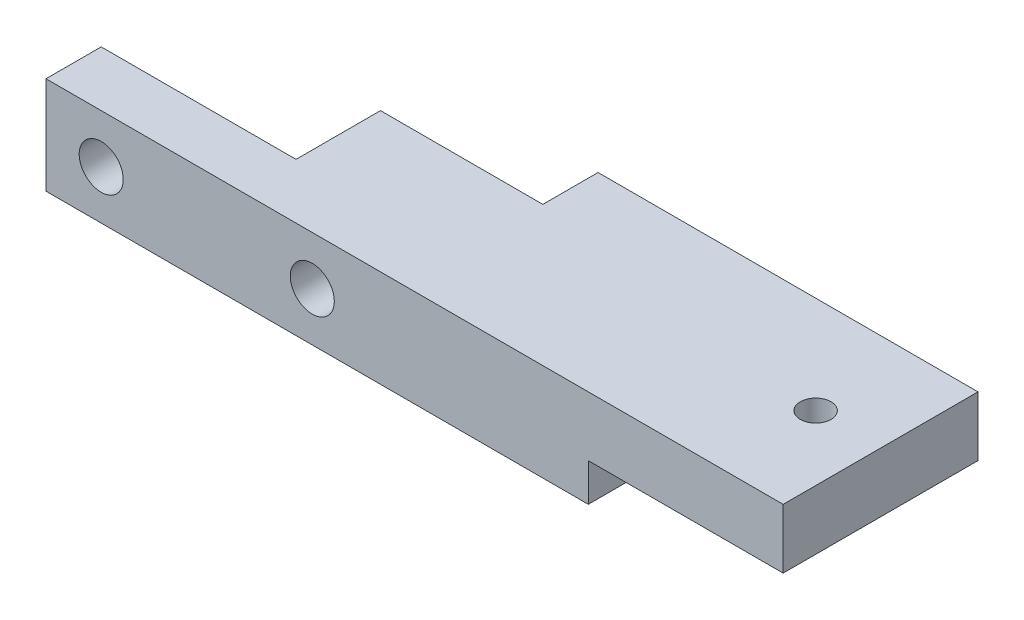
ISO-10303-21;
HEADER;
FILE_DESCRIPTION(('STEP AP214'),'2;1');
FILE_NAME('part.step','',(''),(''),'','','');
FILE_SCHEMA(('AUTOMOTIVE_DESIGN { 1 0 10303 214 1 1 1 1 }'));
ENDSEC;
DATA;
#1=APPLICATION_CONTEXT('core data for automotive mechanical design processes');
#2=APPLICATION_PROTOCOL_DEFINITION('international standard','automotive_design',2000,#1);
#3=PRODUCT_CONTEXT('',#1,'mechanical');
#4=PRODUCT('Part','Part','',(#3));
#5=PRODUCT_RELATED_PRODUCT_CATEGORY('part','',(#4));
#6=PRODUCT_DEFINITION_FORMATION('','',#4);
#7=PRODUCT_DEFINITION_CONTEXT('part definition',#1,'design');
#8=PRODUCT_DEFINITION('design','',#6,#7);
#9=PRODUCT_DEFINITION_SHAPE('','',#8);
#10=(LENGTH_UNIT() NAMED_UNIT(*) SI_UNIT(.MILLI.,.METRE.));
#11=(NAMED_UNIT(*) PLANE_ANGLE_UNIT() SI_UNIT($,.RADIAN.));
#12=(NAMED_UNIT(*) SI_UNIT($,.STERADIAN.) SOLID_ANGLE_UNIT());
#13=UNCERTAINTY_MEASURE_WITH_UNIT(LENGTH_MEASURE(1.E-05),#10,'distance_accuracy_value','');
#14=(GEOMETRIC_REPRESENTATION_CONTEXT(3) GLOBAL_UNCERTAINTY_ASSIGNED_CONTEXT((#13)) GLOBAL_UNIT_ASSIGNED_CONTEXT((#10,
#11,#12)) REPRESENTATION_CONTEXT('',''));
#15=CARTESIAN_POINT('',(0.,0.,0.));
#16=DIRECTION('',(0.,0.,1.));
#17=DIRECTION('',(1.,0.,0.));
#18=AXIS2_PLACEMENT_3D('',#15,#16,#17);
#19=CARTESIAN_POINT('',(0.,4.7625,0.));
#20=DIRECTION('',(0.,-1.,0.));
#21=DIRECTION('',(0.,0.,-1.));
#22=AXIS2_PLACEMENT_3D('',#19,#20,#21);
#23=PLANE('',#22);
#24=DIRECTION('',(0.,0.,1.));
#25=VECTOR('',#24,1.);
#26=CARTESIAN_POINT('',(20.0024999999999,4.7625,-9.52500000000001));
#27=LINE('',#26,#25);
#28=CARTESIAN_POINT('',(20.0024999999999,4.7625,-9.52500000000001));
#29=VERTEX_POINT('',#28);
#30=CARTESIAN_POINT('',(20.0025,4.7625,-4.1275));
#31=VERTEX_POINT('',#30);
#32=EDGE_CURVE('E158',#29,#31,#27,.T.);
#33=ORIENTED_EDGE('',*,*,#32,.T.);
#34=DIRECTION('',(-1.,0.,0.));
#35=VECTOR('',#34,1.);
#36=CARTESIAN_POINT('',(20.0025,4.7625,-4.1275));
#37=LINE('',#36,#35);
#38=CARTESIAN_POINT('',(4.1275,4.7625,-4.1275));
#39=VERTEX_POINT('',#38);
#40=EDGE_CURVE('E95',#31,#39,#37,.T.);
#41=ORIENTED_EDGE('',*,*,#40,.T.);
#42=DIRECTION('',(0.,0.,1.));
#43=VECTOR('',#42,1.);
#44=CARTESIAN_POINT('',(4.1275,4.7625,-4.1275));
#45=LINE('',#44,#43);
#46=CARTESIAN_POINT('',(4.1275,4.7625,4.1275));
#47=VERTEX_POINT('',#46);
#48=EDGE_CURVE('E174',#39,#47,#45,.T.);
#49=ORIENTED_EDGE('',*,*,#48,.T.);
#50=DIRECTION('',(-1.,0.,0.));
#51=VECTOR('',#50,1.);
#52=CARTESIAN_POINT('',(-14.9225,4.7625,4.1275));
#53=LINE('',#52,#51);
#54=CARTESIAN_POINT('',(-14.9225,4.7625,4.1275));
#55=VERTEX_POINT('',#54);
#56=EDGE_CURVE('E188',#47,#55,#53,.T.);
#57=ORIENTED_EDGE('',*,*,#56,.T.);
#58=DIRECTION('',(0.,0.,1.));
#59=VECTOR('',#58,1.);
#60=CARTESIAN_POINT('',(-14.9225,4.7625,4.1275));
#61=LINE('',#60,#59);
#62=CARTESIAN_POINT('',(-14.9225,4.7625,9.525));
#63=VERTEX_POINT('',#62);
#64=EDGE_CURVE('E118',#55,#63,#61,.T.);
#65=ORIENTED_EDGE('',*,*,#64,.T.);
#66=DIRECTION('',(1.,0.,0.));
#67=VECTOR('',#66,1.);
#68=CARTESIAN_POINT('',(-14.9225,4.7625,9.525));
#69=LINE('',#68,#67);
#70=CARTESIAN_POINT('',(57.15,4.7625,9.525));
#71=VERTEX_POINT('',#70);
#72=EDGE_CURVE('E111',#63,#71,#69,.T.);
#73=ORIENTED_EDGE('',*,*,#72,.T.);
#74=DIRECTION('',(0.,0.,-1.));
#75=VECTOR('',#74,1.);
#76=CARTESIAN_POINT('',(57.15,4.7625,-9.525));
#77=LINE('',#76,#75);
#78=CARTESIAN_POINT('',(57.15,4.7625,-9.525));
#79=VERTEX_POINT('',#78);
#80=EDGE_CURVE('E115',#71,#79,#77,.T.);
#81=ORIENTED_EDGE('',*,*,#80,.T.);
#82=DIRECTION('',(-1.,0.,0.));
#83=VECTOR('',#82,1.);
#84=CARTESIAN_POINT('',(20.0024999999999,4.7625,-9.52500000000001));
#85=LINE('',#84,#83);
#86=EDGE_CURVE('E60',#79,#29,#85,.T.);
#87=ORIENTED_EDGE('',*,*,#86,.T.);
#88=EDGE_LOOP('',(#33,#41,#49,#57,#65,#73,#81,#87));
#89=FACE_BOUND('',#88,.T.);
#90=CARTESIAN_POINT('',(50.8,4.7625,0.));
#91=DIRECTION('',(0.,1.,0.));
#92=DIRECTION('',(0.,0.,1.));
#93=AXIS2_PLACEMENT_3D('',#90,#91,#92);
#94=CIRCLE('',#93,1.5);
#95=CARTESIAN_POINT('',(50.8,4.7625,-1.5));
#96=VERTEX_POINT('',#95);
#97=EDGE_CURVE('E147',#96,#96,#94,.T.);
#98=ORIENTED_EDGE('',*,*,#97,.F.);
#99=EDGE_LOOP('',(#98));
#100=FACE_BOUND('',#99,.T.);
#101=ADVANCED_FACE('F35',(#89,#100),#23,.F.);
#102=CARTESIAN_POINT('',(0.,-4.7625,0.));
#103=DIRECTION('',(0.,-1.,0.));
#104=DIRECTION('',(0.,0.,-1.));
#105=AXIS2_PLACEMENT_3D('',#102,#103,#104);
#106=PLANE('',#105);
#107=DIRECTION('',(0.,0.,-1.));
#108=VECTOR('',#107,1.);
#109=CARTESIAN_POINT('',(38.1,-4.7625,9.525));
#110=LINE('',#109,#108);
#111=CARTESIAN_POINT('',(38.1,-4.7625,9.525));
#112=VERTEX_POINT('',#111);
#113=CARTESIAN_POINT('',(38.1,-4.7625,-9.525));
#114=VERTEX_POINT('',#113);
#115=EDGE_CURVE('E214',#112,#114,#110,.T.);
#116=ORIENTED_EDGE('',*,*,#115,.F.);
#117=DIRECTION('',(1.,0.,0.));
#118=VECTOR('',#117,1.);
#119=CARTESIAN_POINT('',(-14.9225,-4.7625,9.525));
#120=LINE('',#119,#118);
#121=CARTESIAN_POINT('',(-14.9225,-4.7625,9.525));
#122=VERTEX_POINT('',#121);
#123=EDGE_CURVE('E155',#122,#112,#120,.T.);
#124=ORIENTED_EDGE('',*,*,#123,.F.);
#125=DIRECTION('',(0.,0.,1.));
#126=VECTOR('',#125,1.);
#127=CARTESIAN_POINT('',(-14.9225,-4.7625,4.1275));
#128=LINE('',#127,#126);
#129=CARTESIAN_POINT('',(-14.9225,-4.7625,4.1275));
#130=VERTEX_POINT('',#129);
#131=EDGE_CURVE('E153',#130,#122,#128,.T.);
#132=ORIENTED_EDGE('',*,*,#131,.F.);
#133=DIRECTION('',(-1.,0.,0.));
#134=VECTOR('',#133,1.);
#135=CARTESIAN_POINT('',(-14.9225,-4.7625,4.1275));
#136=LINE('',#135,#134);
#137=CARTESIAN_POINT('',(4.1275,-4.7625,4.1275));
#138=VERTEX_POINT('',#137);
#139=EDGE_CURVE('E151',#138,#130,#136,.T.);
#140=ORIENTED_EDGE('',*,*,#139,.F.);
#141=DIRECTION('',(0.,0.,1.));
#142=VECTOR('',#141,1.);
#143=CARTESIAN_POINT('',(4.1275,-4.7625,-4.1275));
#144=LINE('',#143,#142);
#145=CARTESIAN_POINT('',(4.1275,-4.7625,-4.1275));
#146=VERTEX_POINT('',#145);
#147=EDGE_CURVE('E149',#146,#138,#144,.T.);
#148=ORIENTED_EDGE('',*,*,#147,.F.);
#149=DIRECTION('',(-1.,0.,0.));
#150=VECTOR('',#149,1.);
#151=CARTESIAN_POINT('',(20.0025,-4.7625,-4.1275));
#152=LINE('',#151,#150);
#153=CARTESIAN_POINT('',(20.0025,-4.7625,-4.1275));
#154=VERTEX_POINT('',#153);
#155=EDGE_CURVE('E146',#154,#146,#152,.T.);
#156=ORIENTED_EDGE('',*,*,#155,.F.);
#157=DIRECTION('',(0.,0.,1.));
#158=VECTOR('',#157,1.);
#159=CARTESIAN_POINT('',(20.0024999999999,-4.7625,-9.52500000000001));
#160=LINE('',#159,#158);
#161=CARTESIAN_POINT('',(20.0024999999999,-4.7625,-9.52500000000001));
#162=VERTEX_POINT('',#161);
#163=EDGE_CURVE('E143',#162,#154,#160,.T.);
#164=ORIENTED_EDGE('',*,*,#163,.F.);
#165=DIRECTION('',(-1.,0.,0.));
#166=VECTOR('',#165,1.);
#167=CARTESIAN_POINT('',(20.0024999999999,-4.7625,-9.52500000000001));
#168=LINE('',#167,#166);
#169=EDGE_CURVE('E87',#114,#162,#168,.T.);
#170=ORIENTED_EDGE('',*,*,#169,.F.);
#171=EDGE_LOOP('',(#116,#124,#132,#140,#148,#156,#164,#170));
#172=FACE_BOUND('',#171,.T.);
#173=ADVANCED_FACE('F178',(#172),#106,.T.);
#174=CARTESIAN_POINT('',(20.0024999999999,4.7625,-9.52500000000001));
#175=DIRECTION('',(1.,0.,0.));
#176=DIRECTION('',(0.,0.,-1.));
#177=AXIS2_PLACEMENT_3D('',#174,#175,#176);
#178=PLANE('',#177);
#179=ORIENTED_EDGE('',*,*,#163,.T.);
#180=DIRECTION('',(0.,-1.,0.));
#181=VECTOR('',#180,1.);
#182=CARTESIAN_POINT('',(20.0025,4.7625,-4.1275));
#183=LINE('',#182,#181);
#184=EDGE_CURVE('E11',#31,#154,#183,.T.);
#185=ORIENTED_EDGE('',*,*,#184,.F.);
#186=ORIENTED_EDGE('',*,*,#32,.F.);
#187=DIRECTION('',(0.,-1.,0.));
#188=VECTOR('',#187,1.);
#189=CARTESIAN_POINT('',(20.0024999999999,4.7625,-9.52500000000001));
#190=LINE('',#189,#188);
#191=EDGE_CURVE('E139',#29,#162,#190,.T.);
#192=ORIENTED_EDGE('',*,*,#191,.T.);
#193=EDGE_LOOP('',(#179,#185,#186,#192));
#194=FACE_BOUND('',#193,.T.);
#195=ADVANCED_FACE('F37',(#194),#178,.F.);
#196=CARTESIAN_POINT('',(20.0025,4.7625,-4.1275));
#197=DIRECTION('',(0.,0.,1.));
#198=DIRECTION('',(1.,0.,0.));
#199=AXIS2_PLACEMENT_3D('',#196,#197,#198);
#200=PLANE('',#199);
#201=CARTESIAN_POINT('',(11.1125,0.,-4.1275));
#202=DIRECTION('',(0.,0.,1.));
#203=DIRECTION('',(1.,0.,0.));
#204=AXIS2_PLACEMENT_3D('',#201,#202,#203);
#205=CIRCLE('',#204,2.15265);
#206=CARTESIAN_POINT('',(13.26515,0.,-4.1275));
#207=VERTEX_POINT('',#206);
#208=EDGE_CURVE('E202',#207,#207,#205,.T.);
#209=ORIENTED_EDGE('',*,*,#208,.T.);
#210=EDGE_LOOP('',(#209));
#211=FACE_BOUND('',#210,.T.);
#212=ORIENTED_EDGE('',*,*,#155,.T.);
#213=DIRECTION('',(0.,-1.,0.));
#214=VECTOR('',#213,1.);
#215=CARTESIAN_POINT('',(4.1275,4.7625,-4.1275));
#216=LINE('',#215,#214);
#217=EDGE_CURVE('E44',#39,#146,#216,.T.);
#218=ORIENTED_EDGE('',*,*,#217,.F.);
#219=ORIENTED_EDGE('',*,*,#40,.F.);
#220=ORIENTED_EDGE('',*,*,#184,.T.);
#221=EDGE_LOOP('',(#212,#218,#219,#220));
#222=FACE_BOUND('',#221,.T.);
#223=ADVANCED_FACE('F231',(#211,#222),#200,.F.);
#224=CARTESIAN_POINT('',(4.1275,4.7625,-4.1275));
#225=DIRECTION('',(1.,0.,0.));
#226=DIRECTION('',(0.,0.,-1.));
#227=AXIS2_PLACEMENT_3D('',#224,#225,#226);
#228=PLANE('',#227);
#229=ORIENTED_EDGE('',*,*,#147,.T.);
#230=DIRECTION('',(0.,-1.,0.));
#231=VECTOR('',#230,1.);
#232=CARTESIAN_POINT('',(4.1275,4.7625,4.1275));
#233=LINE('',#232,#231);
#234=EDGE_CURVE('E165',#47,#138,#233,.T.);
#235=ORIENTED_EDGE('',*,*,#234,.F.);
#236=ORIENTED_EDGE('',*,*,#48,.F.);
#237=ORIENTED_EDGE('',*,*,#217,.T.);
#238=EDGE_LOOP('',(#229,#235,#236,#237));
#239=FACE_BOUND('',#238,.T.);
#240=ADVANCED_FACE('F172',(#239),#228,.F.);
#241=CARTESIAN_POINT('',(-14.9225,4.7625,4.1275));
#242=DIRECTION('',(0.,0.,1.));
#243=DIRECTION('',(1.,0.,0.));
#244=AXIS2_PLACEMENT_3D('',#241,#242,#243);
#245=PLANE('',#244);
#246=CARTESIAN_POINT('',(-9.525,0.,4.1275));
#247=DIRECTION('',(0.,0.,1.));
#248=DIRECTION('',(1.,0.,0.));
#249=AXIS2_PLACEMENT_3D('',#246,#247,#248);
#250=CIRCLE('',#249,2.15265);
#251=CARTESIAN_POINT('',(-7.37235,0.,4.1275));
#252=VERTEX_POINT('',#251);
#253=EDGE_CURVE('E196',#252,#252,#250,.T.);
#254=ORIENTED_EDGE('',*,*,#253,.T.);
#255=EDGE_LOOP('',(#254));
#256=FACE_BOUND('',#255,.T.);
#257=ORIENTED_EDGE('',*,*,#139,.T.);
#258=DIRECTION('',(0.,-1.,0.));
#259=VECTOR('',#258,1.);
#260=CARTESIAN_POINT('',(-14.9225,4.7625,4.1275));
#261=LINE('',#260,#259);
#262=EDGE_CURVE('E162',#55,#130,#261,.T.);
#263=ORIENTED_EDGE('',*,*,#262,.F.);
#264=ORIENTED_EDGE('',*,*,#56,.F.);
#265=ORIENTED_EDGE('',*,*,#234,.T.);
#266=EDGE_LOOP('',(#257,#263,#264,#265));
#267=FACE_BOUND('',#266,.T.);
#268=ADVANCED_FACE('F184',(#256,#267),#245,.F.);
#269=CARTESIAN_POINT('',(-14.9225,4.7625,4.1275));
#270=DIRECTION('',(1.,0.,0.));
#271=DIRECTION('',(0.,0.,-1.));
#272=AXIS2_PLACEMENT_3D('',#269,#270,#271);
#273=PLANE('',#272);
#274=ORIENTED_EDGE('',*,*,#131,.T.);
#275=DIRECTION('',(0.,-1.,0.));
#276=VECTOR('',#275,1.);
#277=CARTESIAN_POINT('',(-14.9225,4.7625,9.525));
#278=LINE('',#277,#276);
#279=EDGE_CURVE('E133',#63,#122,#278,.T.);
#280=ORIENTED_EDGE('',*,*,#279,.F.);
#281=ORIENTED_EDGE('',*,*,#64,.F.);
#282=ORIENTED_EDGE('',*,*,#262,.T.);
#283=EDGE_LOOP('',(#274,#280,#281,#282));
#284=FACE_BOUND('',#283,.T.);
#285=ADVANCED_FACE('F187',(#284),#273,.F.);
#286=CARTESIAN_POINT('',(-14.9225,4.7625,9.525));
#287=DIRECTION('',(0.,0.,-1.));
#288=DIRECTION('',(-1.,0.,0.));
#289=AXIS2_PLACEMENT_3D('',#286,#287,#288);
#290=PLANE('',#289);
#291=CARTESIAN_POINT('',(11.1125,0.,9.525));
#292=DIRECTION('',(0.,0.,1.));
#293=DIRECTION('',(1.,0.,0.));
#294=AXIS2_PLACEMENT_3D('',#291,#292,#293);
#295=CIRCLE('',#294,2.15265);
#296=CARTESIAN_POINT('',(13.26515,0.,9.525));
#297=VERTEX_POINT('',#296);
#298=EDGE_CURVE('E205',#297,#297,#295,.T.);
#299=ORIENTED_EDGE('',*,*,#298,.F.);
#300=EDGE_LOOP('',(#299));
#301=FACE_BOUND('',#300,.T.);
#302=CARTESIAN_POINT('',(-9.525,0.,9.525));
#303=DIRECTION('',(0.,0.,1.));
#304=DIRECTION('',(1.,0.,0.));
#305=AXIS2_PLACEMENT_3D('',#302,#303,#304);
#306=CIRCLE('',#305,2.15265);
#307=CARTESIAN_POINT('',(-7.37235,0.,9.525));
#308=VERTEX_POINT('',#307);
#309=EDGE_CURVE('E199',#308,#308,#306,.T.);
#310=ORIENTED_EDGE('',*,*,#309,.F.);
#311=EDGE_LOOP('',(#310));
#312=FACE_BOUND('',#311,.T.);
#313=ORIENTED_EDGE('',*,*,#123,.T.);
#314=DIRECTION('',(0.,-1.,0.));
#315=VECTOR('',#314,1.);
#316=CARTESIAN_POINT('',(38.1,-1.062500034,9.525));
#317=LINE('',#316,#315);
#318=CARTESIAN_POINT('',(38.1,-1.062500034,9.525));
#319=VERTEX_POINT('',#318);
#320=EDGE_CURVE('E208',#319,#112,#317,.T.);
#321=ORIENTED_EDGE('',*,*,#320,.F.);
#322=DIRECTION('',(-1.,0.,0.));
#323=VECTOR('',#322,1.);
#324=CARTESIAN_POINT('',(57.15,-1.062500034,9.525));
#325=LINE('',#324,#323);
#326=CARTESIAN_POINT('',(57.15,-1.062500034,9.525));
#327=VERTEX_POINT('',#326);
#328=EDGE_CURVE('E130',#327,#319,#325,.T.);
#329=ORIENTED_EDGE('',*,*,#328,.F.);
#330=DIRECTION('',(0.,-1.,0.));
#331=VECTOR('',#330,1.);
#332=CARTESIAN_POINT('',(57.15,4.7625,9.525));
#333=LINE('',#332,#331);
#334=EDGE_CURVE('E125',#71,#327,#333,.T.);
#335=ORIENTED_EDGE('',*,*,#334,.F.);
#336=ORIENTED_EDGE('',*,*,#72,.F.);
#337=ORIENTED_EDGE('',*,*,#279,.T.);
#338=EDGE_LOOP('',(#313,#321,#329,#335,#336,#337));
#339=FACE_BOUND('',#338,.T.);
#340=ADVANCED_FACE('F127',(#301,#312,#339),#290,.F.);
#341=CARTESIAN_POINT('',(57.15,4.7625,-9.525));
#342=DIRECTION('',(-1.,0.,0.));
#343=DIRECTION('',(0.,0.,1.));
#344=AXIS2_PLACEMENT_3D('',#341,#342,#343);
#345=PLANE('',#344);
#346=ORIENTED_EDGE('',*,*,#334,.T.);
#347=DIRECTION('',(0.,0.,1.));
#348=VECTOR('',#347,1.);
#349=CARTESIAN_POINT('',(57.15,-1.062500034,9.525));
#350=LINE('',#349,#348);
#351=CARTESIAN_POINT('',(57.15,-1.062500034,-9.52500000000001));
#352=VERTEX_POINT('',#351);
#353=EDGE_CURVE('E217',#352,#327,#350,.T.);
#354=ORIENTED_EDGE('',*,*,#353,.F.);
#355=DIRECTION('',(0.,-1.,0.));
#356=VECTOR('',#355,1.);
#357=CARTESIAN_POINT('',(57.15,4.7625,-9.525));
#358=LINE('',#357,#356);
#359=EDGE_CURVE('E134',#79,#352,#358,.T.);
#360=ORIENTED_EDGE('',*,*,#359,.F.);
#361=ORIENTED_EDGE('',*,*,#80,.F.);
#362=EDGE_LOOP('',(#346,#354,#360,#361));
#363=FACE_BOUND('',#362,.T.);
#364=ADVANCED_FACE('F136',(#363),#345,.F.);
#365=CARTESIAN_POINT('',(20.0024999999999,4.7625,-9.52500000000001));
#366=DIRECTION('',(0.,0.,1.));
#367=DIRECTION('',(1.,0.,0.));
#368=AXIS2_PLACEMENT_3D('',#365,#366,#367);
#369=PLANE('',#368);
#370=DIRECTION('',(1.,0.,0.));
#371=VECTOR('',#370,1.);
#372=CARTESIAN_POINT('',(57.15,-1.062500034,-9.52500000000001));
#373=LINE('',#372,#371);
#374=CARTESIAN_POINT('',(38.1,-1.062500034,-9.52500000000001));
#375=VERTEX_POINT('',#374);
#376=EDGE_CURVE('E212',#375,#352,#373,.T.);
#377=ORIENTED_EDGE('',*,*,#376,.F.);
#378=DIRECTION('',(0.,-1.,0.));
#379=VECTOR('',#378,1.);
#380=CARTESIAN_POINT('',(38.1,-1.062500034,-9.525));
#381=LINE('',#380,#379);
#382=EDGE_CURVE('E211',#375,#114,#381,.T.);
#383=ORIENTED_EDGE('',*,*,#382,.T.);
#384=ORIENTED_EDGE('',*,*,#169,.T.);
#385=ORIENTED_EDGE('',*,*,#191,.F.);
#386=ORIENTED_EDGE('',*,*,#86,.F.);
#387=ORIENTED_EDGE('',*,*,#359,.T.);
#388=EDGE_LOOP('',(#377,#383,#384,#385,#386,#387));
#389=FACE_BOUND('',#388,.T.);
#390=ADVANCED_FACE('F227',(#389),#369,.F.);
#391=CARTESIAN_POINT('',(50.8,4.7625,0.));
#392=DIRECTION('',(0.,-1.,0.));
#393=DIRECTION('',(0.,0.,-1.));
#394=AXIS2_PLACEMENT_3D('',#391,#392,#393);
#395=CYLINDRICAL_SURFACE('',#394,1.5);
#396=CARTESIAN_POINT('',(50.8,-1.062500034,0.));
#397=DIRECTION('',(0.,1.,0.));
#398=DIRECTION('',(0.,0.,1.));
#399=AXIS2_PLACEMENT_3D('',#396,#397,#398);
#400=CIRCLE('',#399,1.5);
#401=CARTESIAN_POINT('',(50.8,-1.062500034,-1.5));
#402=VERTEX_POINT('',#401);
#403=EDGE_CURVE('E39',#402,#402,#400,.T.);
#404=CARTESIAN_POINT('',(50.8,-1.062500034,-1.5));
#405=CARTESIAN_POINT('',(50.8,-1.0018229503125,-1.5));
#406=CARTESIAN_POINT('',(50.8,-0.941145866625002,-1.5));
#407=CARTESIAN_POINT('',(50.8,-0.819791699250002,-1.5));
#408=CARTESIAN_POINT('',(50.8,-0.759114615562501,-1.5));
#409=CARTESIAN_POINT('',(50.8,-0.637760448187501,-1.5));
#410=CARTESIAN_POINT('',(50.8,-0.577083364500001,-1.5));
#411=CARTESIAN_POINT('',(50.8,-0.455729197125001,-1.5));
#412=CARTESIAN_POINT('',(50.8,-0.395052113437501,-1.5));
#413=CARTESIAN_POINT('',(50.8,-0.273697946062501,-1.5));
#414=CARTESIAN_POINT('',(50.8,-0.213020862375001,-1.5));
#415=CARTESIAN_POINT('',(50.8,-0.0916666950000009,-1.5));
#416=CARTESIAN_POINT('',(50.8,-0.030989611312501,-1.5));
#417=CARTESIAN_POINT('',(50.8,0.0903645560624989,-1.5));
#418=CARTESIAN_POINT('',(50.8,0.151041639749999,-1.5));
#419=CARTESIAN_POINT('',(50.8,0.272395807124999,-1.5));
#420=CARTESIAN_POINT('',(50.8,0.333072890812499,-1.5));
#421=CARTESIAN_POINT('',(50.8,0.454427058187499,-1.5));
#422=CARTESIAN_POINT('',(50.8,0.515104141874999,-1.5));
#423=CARTESIAN_POINT('',(50.8,0.636458309249999,-1.5));
#424=CARTESIAN_POINT('',(50.8,0.697135392937499,-1.5));
#425=CARTESIAN_POINT('',(50.8,0.818489560312499,-1.5));
#426=CARTESIAN_POINT('',(50.8,0.879166643999999,-1.5));
#427=CARTESIAN_POINT('',(50.8,1.000520811375,-1.5));
#428=CARTESIAN_POINT('',(50.8,1.0611978950625,-1.5));
#429=CARTESIAN_POINT('',(50.8,1.1825520624375,-1.5));
#430=CARTESIAN_POINT('',(50.8,1.243229146125,-1.5));
#431=CARTESIAN_POINT('',(50.8,1.3645833135,-1.5));
#432=CARTESIAN_POINT('',(50.8,1.4252603971875,-1.5));
#433=CARTESIAN_POINT('',(50.8,1.5466145645625,-1.5));
#434=CARTESIAN_POINT('',(50.8,1.60729164825,-1.5));
#435=CARTESIAN_POINT('',(50.8,1.728645815625,-1.5));
#436=CARTESIAN_POINT('',(50.8,1.7893228993125,-1.5));
#437=CARTESIAN_POINT('',(50.8,1.9106770666875,-1.5));
#438=CARTESIAN_POINT('',(50.8,1.971354150375,-1.5));
#439=CARTESIAN_POINT('',(50.8,2.09270831775,-1.5));
#440=CARTESIAN_POINT('',(50.8,2.1533854014375,-1.5));
#441=CARTESIAN_POINT('',(50.8,2.2747395688125,-1.5));
#442=CARTESIAN_POINT('',(50.8,2.3354166525,-1.5));
#443=CARTESIAN_POINT('',(50.8,2.456770819875,-1.5));
#444=CARTESIAN_POINT('',(50.8,2.5174479035625,-1.5));
#445=CARTESIAN_POINT('',(50.8,2.6388020709375,-1.5));
#446=CARTESIAN_POINT('',(50.8,2.699479154625,-1.5));
#447=CARTESIAN_POINT('',(50.8,2.820833322,-1.5));
#448=CARTESIAN_POINT('',(50.8,2.8815104056875,-1.5));
#449=CARTESIAN_POINT('',(50.8,3.0028645730625,-1.5));
#450=CARTESIAN_POINT('',(50.8,3.06354165675,-1.5));
#451=CARTESIAN_POINT('',(50.8,3.184895824125,-1.5));
#452=CARTESIAN_POINT('',(50.8,3.2455729078125,-1.5));
#453=CARTESIAN_POINT('',(50.8,3.3669270751875,-1.5));
#454=CARTESIAN_POINT('',(50.8,3.427604158875,-1.5));
#455=CARTESIAN_POINT('',(50.8,3.54895832625,-1.5));
#456=CARTESIAN_POINT('',(50.8,3.6096354099375,-1.5));
#457=CARTESIAN_POINT('',(50.8,3.7309895773125,-1.5));
#458=CARTESIAN_POINT('',(50.8,3.791666661,-1.5));
#459=CARTESIAN_POINT('',(50.8,3.913020828375,-1.5));
#460=CARTESIAN_POINT('',(50.8,3.9736979120625,-1.5));
#461=CARTESIAN_POINT('',(50.8,4.0950520794375,-1.5));
#462=CARTESIAN_POINT('',(50.8,4.155729163125,-1.5));
#463=CARTESIAN_POINT('',(50.8,4.2770833305,-1.5));
#464=CARTESIAN_POINT('',(50.8,4.3377604141875,-1.5));
#465=CARTESIAN_POINT('',(50.8,4.4591145815625,-1.5));
#466=CARTESIAN_POINT('',(50.8,4.51979166525,-1.5));
#467=CARTESIAN_POINT('',(50.8,4.641145832625,-1.5));
#468=CARTESIAN_POINT('',(50.8,4.7018229163125,-1.5));
#469=CARTESIAN_POINT('',(50.8,4.7625,-1.5));
#470=B_SPLINE_CURVE_WITH_KNOTS('',3,(#404,#405,#406,#407,#408,#409,#410,#411,#412,#413,#414,
#415,#416,#417,#418,#419,#420,#421,#422,#423,#424,#425,#426,#427,#428,#429,#430,#431,#432,#433,
#434,#435,#436,#437,#438,#439,#440,#441,#442,#443,#444,#445,#446,#447,#448,#449,#450,#451,#452,
#453,#454,#455,#456,#457,#458,#459,#460,#461,#462,#463,#464,#465,#466,#467,#468,#469),
.UNSPECIFIED.,.F.,.F.,(4,2,2,2,2,2,2,2,2,2,2,2,2,2,2,2,2,2,2,2,2,2,2,2,2,2,2,2,2,2,2,2,4),(0.,
0.1820312510625,0.364062502125001,0.5460937531875,0.72812500425,0.910156255312501,
1.092187506375,1.2742187574375,1.4562500085,1.6382812595625,1.820312510625,2.0023437616875,
2.18437501275,2.3664062638125,2.548437514875,2.7304687659375,2.912500017,3.0945312680625,
3.276562519125,3.4585937701875,3.64062502125,3.8226562723125,4.004687523375,4.1867187744375,
4.3687500255,4.5507812765625,4.732812527625,4.9148437786875,5.09687502975,5.2789062808125,
5.460937531875,5.6429687829375,5.825000034),.UNSPECIFIED.);
#471=EDGE_CURVE('BSEAM247',#402,#96,#470,.T.);
#472=ORIENTED_EDGE('',*,*,#403,.F.);
#473=ORIENTED_EDGE('',*,*,#97,.T.);
#474=ORIENTED_EDGE('',*,*,#471,.T.);
#475=ORIENTED_EDGE('',*,*,#471,.F.);
#476=EDGE_LOOP('',(#472,#474,#473,#475));
#477=FACE_BOUND('',#476,.T.);
#478=ADVANCED_FACE('F247',(#477),#395,.F.);
#479=CARTESIAN_POINT('',(-9.525,0.,-9.52500000000001));
#480=DIRECTION('',(0.,0.,1.));
#481=DIRECTION('',(1.,0.,0.));
#482=AXIS2_PLACEMENT_3D('',#479,#480,#481);
#483=CYLINDRICAL_SURFACE('',#482,2.15265);
#484=ORIENTED_EDGE('',*,*,#309,.T.);
#485=EDGE_LOOP('',(#484));
#486=FACE_BOUND('',#485,.T.);
#487=ORIENTED_EDGE('',*,*,#253,.F.);
#488=EDGE_LOOP('',(#487));
#489=FACE_BOUND('',#488,.T.);
#490=ADVANCED_FACE('F265',(#486,#489),#483,.F.);
#491=CARTESIAN_POINT('',(11.1125,0.,-9.52500000000001));
#492=DIRECTION('',(0.,0.,1.));
#493=DIRECTION('',(1.,0.,0.));
#494=AXIS2_PLACEMENT_3D('',#491,#492,#493);
#495=CYLINDRICAL_SURFACE('',#494,2.15265);
#496=ORIENTED_EDGE('',*,*,#298,.T.);
#497=EDGE_LOOP('',(#496));
#498=FACE_BOUND('',#497,.T.);
#499=ORIENTED_EDGE('',*,*,#208,.F.);
#500=EDGE_LOOP('',(#499));
#501=FACE_BOUND('',#500,.T.);
#502=ADVANCED_FACE('F267',(#498,#501),#495,.F.);
#503=CARTESIAN_POINT('',(38.1,-1.062500034,9.525));
#504=DIRECTION('',(-1.,0.,0.));
#505=DIRECTION('',(0.,0.,1.));
#506=AXIS2_PLACEMENT_3D('',#503,#504,#505);
#507=PLANE('',#506);
#508=ORIENTED_EDGE('',*,*,#115,.T.);
#509=ORIENTED_EDGE('',*,*,#382,.F.);
#510=DIRECTION('',(0.,0.,-1.));
#511=VECTOR('',#510,1.);
#512=CARTESIAN_POINT('',(38.1,-1.062500034,9.525));
#513=LINE('',#512,#511);
#514=EDGE_CURVE('E51',#319,#375,#513,.T.);
#515=ORIENTED_EDGE('',*,*,#514,.F.);
#516=ORIENTED_EDGE('',*,*,#320,.T.);
#517=EDGE_LOOP('',(#508,#509,#515,#516));
#518=FACE_BOUND('',#517,.T.);
#519=ADVANCED_FACE('F273',(#518),#507,.F.);
#520=CARTESIAN_POINT('',(0.,-1.062500034,0.));
#521=DIRECTION('',(0.,1.,0.));
#522=DIRECTION('',(0.,0.,1.));
#523=AXIS2_PLACEMENT_3D('',#520,#521,#522);
#524=PLANE('',#523);
#525=ORIENTED_EDGE('',*,*,#403,.T.);
#526=EDGE_LOOP('',(#525));
#527=FACE_BOUND('',#526,.T.);
#528=ORIENTED_EDGE('',*,*,#353,.T.);
#529=ORIENTED_EDGE('',*,*,#328,.T.);
#530=ORIENTED_EDGE('',*,*,#514,.T.);
#531=ORIENTED_EDGE('',*,*,#376,.T.);
#532=EDGE_LOOP('',(#528,#529,#530,#531));
#533=FACE_BOUND('',#532,.T.);
#534=ADVANCED_FACE('F222',(#527,#533),#524,.F.);
#535=CLOSED_SHELL('',(#101,#173,#195,#223,#240,#268,#285,#340,#364,#390,#478,#490,#502,#519,#534));
#536=MANIFOLD_SOLID_BREP('B2',#535);
#537=ADVANCED_BREP_SHAPE_REPRESENTATION('',(#18,#536),#14);
#538=SHAPE_DEFINITION_REPRESENTATION(#9,#537);
ENDSEC;
END-ISO-10303-21;
